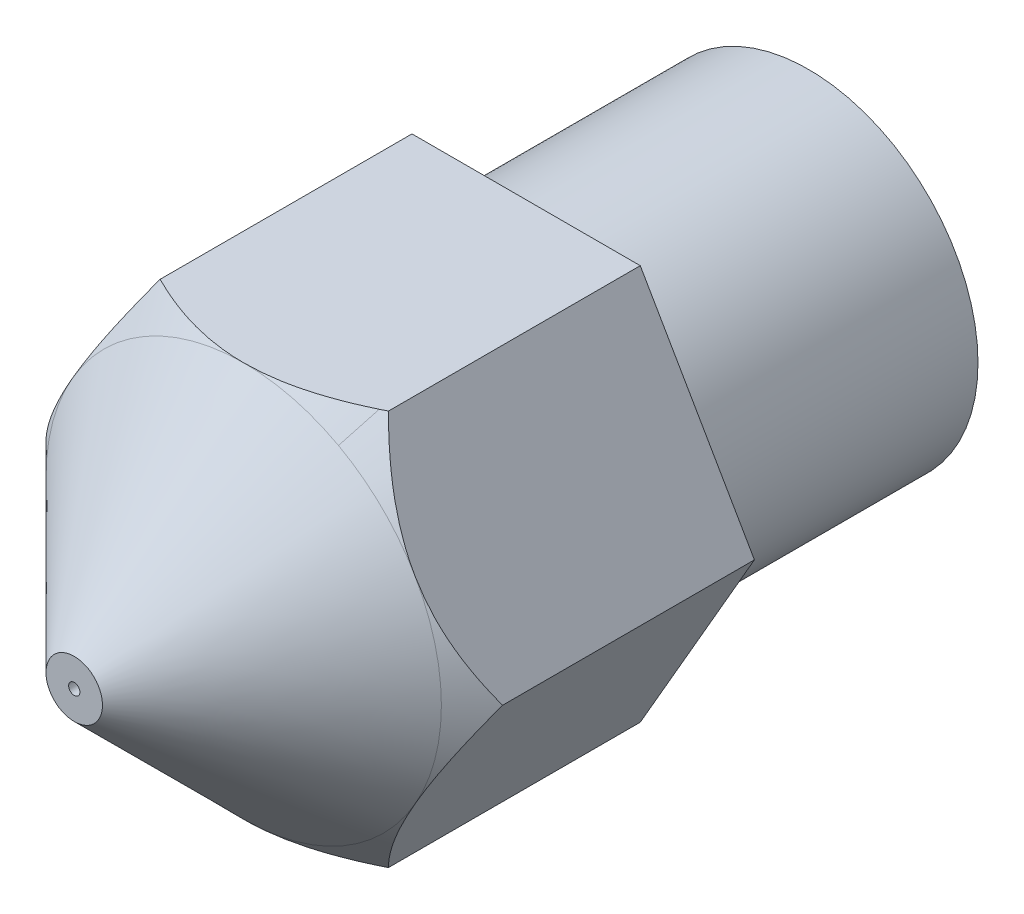
ISO-10303-21;
HEADER;
FILE_DESCRIPTION(('STEP AP214'),'2;1');
FILE_NAME('part.step','',(''),(''),'','','');
FILE_SCHEMA(('AUTOMOTIVE_DESIGN { 1 0 10303 214 1 1 1 1 }'));
ENDSEC;
DATA;
#1=APPLICATION_CONTEXT('core data for automotive mechanical design processes');
#2=APPLICATION_PROTOCOL_DEFINITION('international standard','automotive_design',2000,#1);
#3=PRODUCT_CONTEXT('',#1,'mechanical');
#4=PRODUCT('Part','Part','',(#3));
#5=PRODUCT_RELATED_PRODUCT_CATEGORY('part','',(#4));
#6=PRODUCT_DEFINITION_FORMATION('','',#4);
#7=PRODUCT_DEFINITION_CONTEXT('part definition',#1,'design');
#8=PRODUCT_DEFINITION('design','',#6,#7);
#9=PRODUCT_DEFINITION_SHAPE('','',#8);
#10=(LENGTH_UNIT() NAMED_UNIT(*) SI_UNIT(.MILLI.,.METRE.));
#11=(NAMED_UNIT(*) PLANE_ANGLE_UNIT() SI_UNIT($,.RADIAN.));
#12=(NAMED_UNIT(*) SI_UNIT($,.STERADIAN.) SOLID_ANGLE_UNIT());
#13=UNCERTAINTY_MEASURE_WITH_UNIT(LENGTH_MEASURE(1.E-05),#10,'distance_accuracy_value','');
#14=(GEOMETRIC_REPRESENTATION_CONTEXT(3) GLOBAL_UNCERTAINTY_ASSIGNED_CONTEXT((#13)) GLOBAL_UNIT_ASSIGNED_CONTEXT((#10,
#11,#12)) REPRESENTATION_CONTEXT('',''));
#15=CARTESIAN_POINT('',(0.,0.,0.));
#16=DIRECTION('',(0.,0.,1.));
#17=DIRECTION('',(1.,0.,0.));
#18=AXIS2_PLACEMENT_3D('',#15,#16,#17);
#19=CARTESIAN_POINT('',(0.,0.,8.));
#20=DIRECTION('',(0.,0.,1.));
#21=DIRECTION('',(1.,0.,0.));
#22=AXIS2_PLACEMENT_3D('',#19,#20,#21);
#23=PLANE('',#22);
#24=CARTESIAN_POINT('',(0.,0.,8.));
#25=DIRECTION('',(0.,0.,1.));
#26=DIRECTION('',(1.,0.,0.));
#27=AXIS2_PLACEMENT_3D('',#24,#25,#26);
#28=CIRCLE('',#27,0.1);
#29=CARTESIAN_POINT('',(0.1,0.,8.));
#30=VERTEX_POINT('',#29);
#31=EDGE_CURVE('E163',#30,#30,#28,.F.);
#32=ORIENTED_EDGE('',*,*,#31,.T.);
#33=EDGE_LOOP('',(#32));
#34=FACE_BOUND('',#33,.T.);
#35=CARTESIAN_POINT('',(0.,0.,7.99999999998136));
#36=DIRECTION('',(0.,0.,-1.));
#37=DIRECTION('',(-1.,0.,0.));
#38=AXIS2_PLACEMENT_3D('',#35,#36,#37);
#39=CIRCLE('',#38,0.499999999966849);
#40=CARTESIAN_POINT('',(-0.499999999966849,0.,7.99999999998136));
#41=VERTEX_POINT('',#40);
#42=EDGE_CURVE('E19',#41,#41,#39,.T.);
#43=ORIENTED_EDGE('',*,*,#42,.F.);
#44=EDGE_LOOP('',(#43));
#45=FACE_BOUND('',#44,.T.);
#46=ADVANCED_FACE('F16',(#34,#45),#23,.T.);
#47=CARTESIAN_POINT('',(0.,0.,4.99999999999545));
#48=DIRECTION('',(0.,0.,-1.));
#49=DIRECTION('',(-1.,0.,0.));
#50=AXIS2_PLACEMENT_3D('',#47,#48,#49);
#51=CONICAL_SURFACE('',#50,3.49999999999449,0.785398163404405);
#52=ORIENTED_EDGE('',*,*,#42,.T.);
#53=EDGE_LOOP('',(#52));
#54=FACE_BOUND('',#53,.T.);
#55=CARTESIAN_POINT('',(0.,0.,4.99999999999545));
#56=DIRECTION('',(0.,0.,-1.));
#57=DIRECTION('',(-0.479425538613188,-0.877582561885464,0.));
#58=AXIS2_PLACEMENT_3D('',#55,#56,#57);
#59=CIRCLE('',#58,3.49999999999449);
#60=CARTESIAN_POINT('',(1.67798938511631,3.07153896660527,4.99999999999545));
#61=VERTEX_POINT('',#60);
#62=CARTESIAN_POINT('',(3.03108891324506,1.74999999999715,4.99999999999179));
#63=VERTEX_POINT('',#62);
#64=EDGE_CURVE('E158',#61,#63,#59,.T.);
#65=ORIENTED_EDGE('',*,*,#64,.F.);
#66=CARTESIAN_POINT('',(0.,0.,4.99999999999545));
#67=DIRECTION('',(0.,0.,-1.));
#68=DIRECTION('',(-0.479425538613188,-0.877582561885464,0.));
#69=AXIS2_PLACEMENT_3D('',#66,#67,#68);
#70=CIRCLE('',#69,3.49999999999449);
#71=CARTESIAN_POINT('',(0.,3.49999999999725,4.9999999999927));
#72=VERTEX_POINT('',#71);
#73=EDGE_CURVE('E154',#72,#61,#70,.T.);
#74=ORIENTED_EDGE('',*,*,#73,.F.);
#75=CARTESIAN_POINT('',(0.,0.,4.99999999999545));
#76=DIRECTION('',(0.,0.,-1.));
#77=DIRECTION('',(-0.479425538613188,-0.877582561885464,0.));
#78=AXIS2_PLACEMENT_3D('',#75,#76,#77);
#79=CIRCLE('',#78,3.49999999999449);
#80=CARTESIAN_POINT('',(-3.03108891324352,1.74999999999799,4.99999999999408));
#81=VERTEX_POINT('',#80);
#82=EDGE_CURVE('E145',#81,#72,#79,.T.);
#83=ORIENTED_EDGE('',*,*,#82,.F.);
#84=CARTESIAN_POINT('',(0.,0.,4.99999999999545));
#85=DIRECTION('',(0.,0.,-1.));
#86=DIRECTION('',(-0.479425538613188,-0.877582561885464,0.));
#87=AXIS2_PLACEMENT_3D('',#84,#85,#86);
#88=CIRCLE('',#87,3.49999999999449);
#89=CARTESIAN_POINT('',(-3.03108891324506,-1.74999999999715,4.99999999999179));
#90=VERTEX_POINT('',#89);
#91=EDGE_CURVE('E109',#90,#81,#88,.T.);
#92=ORIENTED_EDGE('',*,*,#91,.F.);
#93=CARTESIAN_POINT('',(0.,0.,4.99999999999545));
#94=DIRECTION('',(0.,0.,-1.));
#95=DIRECTION('',(-0.479425538613188,-0.877582561885464,0.));
#96=AXIS2_PLACEMENT_3D('',#93,#94,#95);
#97=CIRCLE('',#96,3.49999999999449);
#98=CARTESIAN_POINT('',(-1.67798938514352,-3.07153896659429,4.99999999999545));
#99=VERTEX_POINT('',#98);
#100=EDGE_CURVE('E110',#99,#90,#97,.T.);
#101=ORIENTED_EDGE('',*,*,#100,.F.);
#102=CARTESIAN_POINT('',(0.,0.,4.99999999999545));
#103=DIRECTION('',(0.,0.,-1.));
#104=DIRECTION('',(-0.479425538613188,-0.877582561885464,0.));
#105=AXIS2_PLACEMENT_3D('',#102,#103,#104);
#106=CIRCLE('',#105,3.49999999999449);
#107=CARTESIAN_POINT('',(0.,-3.49999999999725,4.9999999999927));
#108=VERTEX_POINT('',#107);
#109=EDGE_CURVE('E143',#108,#99,#106,.T.);
#110=ORIENTED_EDGE('',*,*,#109,.F.);
#111=CARTESIAN_POINT('',(0.,0.,4.99999999999545));
#112=DIRECTION('',(0.,0.,-1.));
#113=DIRECTION('',(-0.479425538613188,-0.877582561885464,0.));
#114=AXIS2_PLACEMENT_3D('',#111,#112,#113);
#115=CIRCLE('',#114,3.49999999999449);
#116=CARTESIAN_POINT('',(3.03108891324233,-1.7499999999973,4.99999999999545));
#117=VERTEX_POINT('',#116);
#118=EDGE_CURVE('E159',#117,#108,#115,.T.);
#119=ORIENTED_EDGE('',*,*,#118,.F.);
#120=CARTESIAN_POINT('',(0.,0.,4.99999999999545));
#121=DIRECTION('',(0.,0.,-1.));
#122=DIRECTION('',(-0.479425538613188,-0.877582561885464,0.));
#123=AXIS2_PLACEMENT_3D('',#120,#121,#122);
#124=CIRCLE('',#123,3.49999999999449);
#125=EDGE_CURVE('E169',#63,#117,#124,.T.);
#126=ORIENTED_EDGE('',*,*,#125,.F.);
#127=EDGE_LOOP('',(#65,#74,#83,#92,#101,#110,#119,#126));
#128=FACE_BOUND('',#127,.T.);
#129=ADVANCED_FACE('F316',(#54,#128),#51,.T.);
#130=CARTESIAN_POINT('',(0.,0.,1.));
#131=DIRECTION('',(0.,0.,1.));
#132=DIRECTION('',(1.,0.,0.));
#133=AXIS2_PLACEMENT_3D('',#130,#131,#132);
#134=CYLINDRICAL_SURFACE('',#133,0.1);
#135=ORIENTED_EDGE('',*,*,#31,.F.);
#136=EDGE_LOOP('',(#135));
#137=FACE_BOUND('',#136,.T.);
#138=CARTESIAN_POINT('',(0.,0.,1.99999999995271));
#139=DIRECTION('',(0.,0.,-1.));
#140=DIRECTION('',(-0.499999999936058,0.866025403821355,0.));
#141=AXIS2_PLACEMENT_3D('',#138,#139,#140);
#142=CIRCLE('',#141,0.10000000004453);
#143=CARTESIAN_POINT('',(0.,0.100000000031742,1.99999999995271));
#144=VERTEX_POINT('',#143);
#145=EDGE_CURVE('E166',#144,#144,#142,.T.);
#146=ORIENTED_EDGE('',*,*,#145,.T.);
#147=EDGE_LOOP('',(#146));
#148=FACE_BOUND('',#147,.T.);
#149=ADVANCED_FACE('F313',(#137,#148),#134,.F.);
#150=CARTESIAN_POINT('',(0.,0.,4.50884188188638));
#151=DIRECTION('',(0.,0.,-1.));
#152=DIRECTION('',(-1.,0.,0.));
#153=AXIS2_PLACEMENT_3D('',#150,#151,#152);
#154=CONICAL_SURFACE('',#153,3.99115811808314,0.785398163376653);
#155=DIRECTION('',(-0.339005049414701,-0.62054458056685,0.707106781186864));
#156=VECTOR('',#155,1.);
#157=CARTESIAN_POINT('',(239237.418875991,437921.157837067,-499000.));
#158=LINE('',#157,#156);
#159=CARTESIAN_POINT('',(1.91205871444601,3.50000000001546,4.51177125432949));
#160=VERTEX_POINT('',#159);
#161=EDGE_CURVE('E155',#160,#61,#158,.T.);
#162=ORIENTED_EDGE('',*,*,#161,.F.);
#163=CARTESIAN_POINT('',(0.,3.5,4.99999999998995));
#164=CARTESIAN_POINT('',(0.0537438893032108,3.5,5.00000431749704));
#165=CARTESIAN_POINT('',(0.107479833407779,3.5,4.99876149669539));
#166=CARTESIAN_POINT('',(0.214830405224614,3.5,4.9938221542953));
#167=CARTESIAN_POINT('',(0.26844505113223,3.5,4.9901260291036));
#168=CARTESIAN_POINT('',(0.428769144050172,3.5,4.97543679142863));
#169=CARTESIAN_POINT('',(0.535166225902362,3.5,4.96084250504679));
#170=CARTESIAN_POINT('',(0.744779456587498,3.5,4.92310106018742));
#171=CARTESIAN_POINT('',(0.848019372518869,3.5,4.90008257610918));
#172=CARTESIAN_POINT('',(1.05252816611021,3.5,4.84649885465057));
#173=CARTESIAN_POINT('',(1.15379650458905,3.5,4.81593158327798));
#174=CARTESIAN_POINT('',(1.36592879175843,3.5,4.74438489942457));
#175=CARTESIAN_POINT('',(1.47652073770405,3.5,4.7026037731094));
#176=CARTESIAN_POINT('',(1.64079899800747,3.5,4.63480851594186));
#177=CARTESIAN_POINT('',(1.69551871252038,3.5,4.61124519525393));
#178=CARTESIAN_POINT('',(1.804286325757,3.5,4.56260407103472));
#179=CARTESIAN_POINT('',(1.85833417615542,3.5,4.53752615931454));
#180=CARTESIAN_POINT('',(1.91205871444325,3.5,4.51177125433852));
#181=B_SPLINE_CURVE_WITH_KNOTS('',3,(#163,#164,#165,#166,#167,#168,#169,#170,#171,#172,#173,
#174,#175,#176,#177,#178,#179,#180),.UNSPECIFIED.,.F.,.F.,(4,2,2,2,2,2,2,2,4),(0.,
0.161202115345872,0.322378189873716,0.644110241389111,0.96112022882094,1.27821572677109,
1.63260008764051,1.81131453854064,1.99004177034235),.UNSPECIFIED.);
#182=EDGE_CURVE('E303',#72,#160,#181,.T.);
#183=ORIENTED_EDGE('',*,*,#182,.F.);
#184=ORIENTED_EDGE('',*,*,#73,.T.);
#185=EDGE_LOOP('',(#162,#183,#184));
#186=FACE_BOUND('',#185,.T.);
#187=ADVANCED_FACE('F309',(#186),#154,.T.);
#188=CARTESIAN_POINT('',(0.,0.,4.45529940435563));
#189=DIRECTION('',(0.,0.,-1.));
#190=DIRECTION('',(-1.,0.,0.));
#191=AXIS2_PLACEMENT_3D('',#188,#189,#190);
#192=CONICAL_SURFACE('',#191,4.04470059560024,0.785398163366167);
#193=CARTESIAN_POINT('',(-2.0207259421453,3.50000000000495,4.4585481156406));
#194=CARTESIAN_POINT('',(-1.88093245125424,3.50000000000178,4.52837901779885));
#195=CARTESIAN_POINT('',(-1.73877627194134,3.50000000000048,4.59408444813629));
#196=CARTESIAN_POINT('',(-1.44879621006772,3.49999999999952,4.71432170134832));
#197=CARTESIAN_POINT('',(-1.30094201394446,3.49999999999987,4.76877974900684));
#198=CARTESIAN_POINT('',(-1.00476955778069,3.50000000000012,4.86126198885048));
#199=CARTESIAN_POINT('',(-0.856589672550079,3.50000000000003,4.89971780194353));
#200=CARTESIAN_POINT('',(-0.557051165534245,3.49999999999997,4.95896722032684));
#201=CARTESIAN_POINT('',(-0.405703721611407,3.5,4.97981478228911));
#202=CARTESIAN_POINT('',(-0.211604713619826,3.5,4.99386421136813));
#203=CARTESIAN_POINT('',(-0.169418902116069,3.5,4.99615704013281));
#204=CARTESIAN_POINT('',(-0.0848248871934939,3.5,4.99922734323527));
#205=CARTESIAN_POINT('',(-0.0424164647566726,3.5,4.99999877926437));
#206=CARTESIAN_POINT('',(0.,3.5,4.99999999998995));
#207=B_SPLINE_CURVE_WITH_KNOTS('',3,(#193,#194,#195,#196,#197,#198,#199,#200,#201,#202,#203,
#204,#205,#206),.UNSPECIFIED.,.F.,.F.,(4,2,2,2,2,2,4),(0.,0.469138863495916,0.941263532800035,
1.39966676490611,1.85666017013994,1.9833846993536,2.11061118578312),.UNSPECIFIED.);
#208=CARTESIAN_POINT('',(-2.02072594215211,3.5,4.45854811563448));
#209=VERTEX_POINT('',#208);
#210=EDGE_CURVE('E168',#209,#72,#207,.T.);
#211=ORIENTED_EDGE('',*,*,#210,.F.);
#212=CARTESIAN_POINT('',(-3.03108891324427,1.74999999999669,4.9999999999927));
#213=CARTESIAN_POINT('',(-3.00421079533933,1.79655426581984,5.00000430478493));
#214=CARTESIAN_POINT('',(-2.97733669567372,1.84310157184832,4.99876092163781));
#215=CARTESIAN_POINT('',(-2.92364907978139,1.93609125031104,4.99381933157334));
#216=CARTESIAN_POINT('',(-2.89683555469021,1.98253363809896,4.99012151081294));
#217=CARTESIAN_POINT('',(-2.81665771079426,2.12140573736801,4.97542599030519));
#218=CARTESIAN_POINT('',(-2.7634495324566,2.21356500562696,4.96082591162071));
#219=CARTESIAN_POINT('',(-2.65864660024935,2.39508900899203,4.92307849944173));
#220=CARTESIAN_POINT('',(-2.60703961580362,2.48447492807741,4.90006339489302));
#221=CARTESIAN_POINT('',(-2.50480485278373,2.66155073192752,4.84648680808277));
#222=CARTESIAN_POINT('',(-2.45417738625082,2.74924007622099,4.8159229623821));
#223=CARTESIAN_POINT('',(-2.37137915307603,2.89265082285657,4.76007104483655));
#224=CARTESIAN_POINT('',(-2.33889170641545,2.94892073108087,4.73662459520982));
#225=CARTESIAN_POINT('',(-2.27439263502874,3.06063639976359,4.68728344893833));
#226=CARTESIAN_POINT('',(-2.24238091158375,3.11608233120814,4.66138926867729));
#227=CARTESIAN_POINT('',(-2.17849278972643,3.22673980426511,4.60714796470752));
#228=CARTESIAN_POINT('',(-2.14662121330806,3.281942993939,4.57877824562128));
#229=CARTESIAN_POINT('',(-2.08333556510007,3.39155695202512,4.52007399758517));
#230=CARTESIAN_POINT('',(-2.05192146301108,3.44596777291738,4.48973959949117));
#231=CARTESIAN_POINT('',(-2.02072594216774,3.49999999998659,4.45854811563828));
#232=B_SPLINE_CURVE_WITH_KNOTS('',3,(#212,#213,#214,#215,#216,#217,#218,#219,#220,#221,#222,
#223,#224,#225,#226,#227,#228,#229,#230,#231),.UNSPECIFIED.,.F.,.F.,(4,2,2,2,2,2,2,2,2,4),(0.,
0.161238963214723,0.32245256469639,0.644242625542242,0.961179512540262,1.27821575553687,
1.4853966724577,1.69253397873911,1.90181313166027,2.11107836001675),.UNSPECIFIED.);
#233=EDGE_CURVE('E274',#81,#209,#232,.T.);
#234=ORIENTED_EDGE('',*,*,#233,.F.);
#235=ORIENTED_EDGE('',*,*,#82,.T.);
#236=EDGE_LOOP('',(#211,#234,#235));
#237=FACE_BOUND('',#236,.T.);
#238=ADVANCED_FACE('F260',(#237),#192,.T.);
#239=CARTESIAN_POINT('',(0.,0.,4.45529940435563));
#240=DIRECTION('',(0.,0.,-1.));
#241=DIRECTION('',(-1.,0.,0.));
#242=AXIS2_PLACEMENT_3D('',#239,#240,#241);
#243=CONICAL_SURFACE('',#242,4.04470059560024,0.785398163366167);
#244=CARTESIAN_POINT('',(-2.02072594544719,-3.49999999431558,4.4585481189098));
#245=CARTESIAN_POINT('',(-2.09062269069288,-3.3789352802664,4.52837902070183));
#246=CARTESIAN_POINT('',(-2.16170078014426,-3.25582441803175,4.59408445067835));
#247=CARTESIAN_POINT('',(-2.30669081065126,-3.00469431860279,4.71432170320178));
#248=CARTESIAN_POINT('',(-2.38061790848794,-2.87664882909362,4.76877975053348));
#249=CARTESIAN_POINT('',(-2.52870413611872,-2.62015595893601,4.86126198980828));
#250=CARTESIAN_POINT('',(-2.60279407850878,-2.49182841438666,4.8997178026552));
#251=CARTESIAN_POINT('',(-2.75256333155182,-2.2324204587046,4.95896722064473));
#252=CARTESIAN_POINT('',(-2.82823705327371,-2.10134972788451,4.97981478245866));
#253=CARTESIAN_POINT('',(-2.92528655692934,-1.93325505670372,4.99386421142341));
#254=CARTESIAN_POINT('',(-2.94637946258379,-1.89672107243096,4.99615704016684));
#255=CARTESIAN_POINT('',(-2.98867646984895,-1.82346050683963,4.99922734324072));
#256=CARTESIAN_POINT('',(-3.00988068096865,-1.78673373584592,4.99999877926258));
#257=CARTESIAN_POINT('',(-3.03108891324823,-1.74999999999898,4.99999999998812));
#258=B_SPLINE_CURVE_WITH_KNOTS('',3,(#244,#245,#246,#247,#248,#249,#250,#251,#252,#253,#254,
#255,#256,#257),.UNSPECIFIED.,.F.,.F.,(4,2,2,2,2,2,4),(0.,0.469138861928364,0.941263529629626,
1.39966676024786,1.85666016400893,1.98338469263572,2.11061117847293),.UNSPECIFIED.);
#259=CARTESIAN_POINT('',(-2.02072595931352,-3.49999999715779,4.4585481095152));
#260=VERTEX_POINT('',#259);
#261=EDGE_CURVE('E114',#260,#90,#258,.T.);
#262=ORIENTED_EDGE('',*,*,#261,.F.);
#263=CARTESIAN_POINT('',(-2.02072597317138,-3.49999999996139,4.45854810010368));
#264=CARTESIAN_POINT('',(-2.00268836185175,-3.49999999998069,4.46756888870002));
#265=CARTESIAN_POINT('',(-1.98461395233641,-3.49999999999357,4.47651454535225));
#266=CARTESIAN_POINT('',(-1.94839153278238,-3.50000000000643,4.49425559679223));
#267=CARTESIAN_POINT('',(-1.93024352272689,-3.50000000000643,4.5030509915457));
#268=CARTESIAN_POINT('',(-1.91205871445891,-3.5,4.51177125432077));
#269=B_SPLINE_CURVE_WITH_KNOTS('',3,(#263,#264,#265,#266,#267,#268),.UNSPECIFIED.,.F.,.F.,(4,2,
4),(0.,0.0605010865225517,0.121002186848004),.UNSPECIFIED.);
#270=CARTESIAN_POINT('',(-1.91205871447004,-3.49999999998704,4.51177125432478));
#271=VERTEX_POINT('',#270);
#272=EDGE_CURVE('E97',#260,#271,#269,.T.);
#273=ORIENTED_EDGE('',*,*,#272,.T.);
#274=DIRECTION('',(0.339005049420893,0.620544580563467,0.707106781186864));
#275=VECTOR('',#274,1.);
#276=CARTESIAN_POINT('',(-239237.418880361,-437921.157834679,-499000.));
#277=LINE('',#276,#275);
#278=EDGE_CURVE('E377',#99,#271,#277,.F.);
#279=ORIENTED_EDGE('',*,*,#278,.F.);
#280=ORIENTED_EDGE('',*,*,#100,.T.);
#281=EDGE_LOOP('',(#262,#273,#279,#280));
#282=FACE_BOUND('',#281,.T.);
#283=ADVANCED_FACE('F115',(#282),#243,.T.);
#284=CARTESIAN_POINT('',(0.,0.,4.45529940435563));
#285=DIRECTION('',(0.,0.,-1.));
#286=DIRECTION('',(-1.,0.,0.));
#287=AXIS2_PLACEMENT_3D('',#284,#285,#286);
#288=CONICAL_SURFACE('',#287,4.04470059560024,0.785398163366167);
#289=CARTESIAN_POINT('',(-4.04145188432461,1.39690937472253E-11,4.45854811564121));
#290=CARTESIAN_POINT('',(-3.97155513887492,0.121064714407657,4.52837901779927));
#291=CARTESIAN_POINT('',(-3.90047704921663,0.244175576997057,4.59408444813683));
#292=CARTESIAN_POINT('',(-3.75548701827816,0.495305677170666,4.71432170134937));
#293=CARTESIAN_POINT('',(-3.68155992021672,0.623351167070123,4.76877974900827));
#294=CARTESIAN_POINT('',(-3.53347369213465,0.879844038010078,4.86126198885251));
#295=CARTESIAN_POINT('',(-3.45938374951897,1.00817158294998,4.89971780194577));
#296=CARTESIAN_POINT('',(-3.30961449601044,1.2675795394381,4.95896722032942));
#297=CARTESIAN_POINT('',(-3.23394077404879,1.39865027067354,4.97981478229181));
#298=CARTESIAN_POINT('',(-3.13689127005297,1.56674494244358,4.99386421137084));
#299=CARTESIAN_POINT('',(-3.11579836430133,1.60327892688466,4.99615704013551));
#300=CARTESIAN_POINT('',(-3.07350135684053,1.67653949281485,4.99922734323797));
#301=CARTESIAN_POINT('',(-3.05229714562236,1.71326626397912,4.99999877926709));
#302=CARTESIAN_POINT('',(-3.03108891324427,1.74999999999669,4.9999999999927));
#303=B_SPLINE_CURVE_WITH_KNOTS('',3,(#289,#290,#291,#292,#293,#294,#295,#296,#297,#298,#299,
#300,#301,#302),.UNSPECIFIED.,.F.,.F.,(4,2,2,2,2,2,4),(0.,0.469138863497394,0.941263532803068,
1.39966676491064,1.85666017014595,1.98338469935812,2.11061118578613),.UNSPECIFIED.);
#304=CARTESIAN_POINT('',(-4.04145188432394,5.91748705095474E-12,4.45854811563213));
#305=VERTEX_POINT('',#304);
#306=EDGE_CURVE('E281',#305,#81,#303,.T.);
#307=ORIENTED_EDGE('',*,*,#306,.F.);
#308=CARTESIAN_POINT('',(-3.03108891324823,-1.74999999999898,4.99999999998812));
#309=CARTESIAN_POINT('',(-3.05796703115323,-1.70344573417571,5.00000430478026));
#310=CARTESIAN_POINT('',(-3.08484113081891,-1.65689842814711,4.99876092163304));
#311=CARTESIAN_POINT('',(-3.13852874671138,-1.56390874968416,4.99381933156837));
#312=CARTESIAN_POINT('',(-3.16534227180262,-1.51746636189613,4.99012151080787));
#313=CARTESIAN_POINT('',(-3.24552011569877,-1.37859426262674,4.97542599029979));
#314=CARTESIAN_POINT('',(-3.29872829403655,-1.28643499436757,4.96082591161508));
#315=CARTESIAN_POINT('',(-3.40353122624404,-1.10491099100209,4.92307849943563));
#316=CARTESIAN_POINT('',(-3.45513821068989,-1.01552507191651,4.90006339488668));
#317=CARTESIAN_POINT('',(-3.55737297371,-0.838449268066001,4.84648680807595));
#318=CARTESIAN_POINT('',(-3.60800044024303,-0.750759923772347,4.81592296237503));
#319=CARTESIAN_POINT('',(-3.69079867341746,-0.60734917713738,4.76007104482944));
#320=CARTESIAN_POINT('',(-3.72328612007759,-0.551079268913879,4.73662459520295));
#321=CARTESIAN_POINT('',(-3.78778519146338,-0.439363600232722,4.68728344893202));
#322=CARTESIAN_POINT('',(-3.81979691490794,-0.38391766878894,4.6613892686713));
#323=CARTESIAN_POINT('',(-3.88368503676437,-0.273260195733504,4.60714796470225));
#324=CARTESIAN_POINT('',(-3.91555661318229,-0.218057006060384,4.57877824561641));
#325=CARTESIAN_POINT('',(-3.97884226138941,-0.10844304797578,4.52007399758115));
#326=CARTESIAN_POINT('',(-4.01025636347797,-0.0540322270842658,4.4897395994876));
#327=CARTESIAN_POINT('',(-4.04145188432089,-1.57824670111829E-11,4.45854811563519));
#328=B_SPLINE_CURVE_WITH_KNOTS('',3,(#308,#309,#310,#311,#312,#313,#314,#315,#316,#317,#318,
#319,#320,#321,#322,#323,#324,#325,#326,#327),.UNSPECIFIED.,.F.,.F.,(4,2,2,2,2,2,2,2,2,4),(0.,
0.161238963215139,0.322452564697221,0.6442426255439,0.961179512542764,1.27821575554022,
1.48539667245821,1.69253397873679,1.90181313165504,2.11107836000861),.UNSPECIFIED.);
#329=EDGE_CURVE('E119',#90,#305,#328,.T.);
#330=ORIENTED_EDGE('',*,*,#329,.F.);
#331=ORIENTED_EDGE('',*,*,#91,.T.);
#332=EDGE_LOOP('',(#307,#330,#331));
#333=FACE_BOUND('',#332,.T.);
#334=ADVANCED_FACE('F259',(#333),#288,.T.);
#335=CARTESIAN_POINT('',(0.,0.,4.50884188188638));
#336=DIRECTION('',(0.,0.,-1.));
#337=DIRECTION('',(-1.,0.,0.));
#338=AXIS2_PLACEMENT_3D('',#335,#336,#337);
#339=CONICAL_SURFACE('',#338,3.99115811808314,0.785398163376653);
#340=ORIENTED_EDGE('',*,*,#278,.T.);
#341=CARTESIAN_POINT('',(0.,-3.5,4.99999999998994));
#342=CARTESIAN_POINT('',(-0.0537438893032127,-3.5,5.00000431749703));
#343=CARTESIAN_POINT('',(-0.107479833407783,-3.5,4.99876149669538));
#344=CARTESIAN_POINT('',(-0.214830405224623,-3.5,4.99382215429529));
#345=CARTESIAN_POINT('',(-0.268445051132242,-3.5,4.99012602910359));
#346=CARTESIAN_POINT('',(-0.42876914405019,-3.5,4.97543679142862));
#347=CARTESIAN_POINT('',(-0.535166225902384,-3.5,4.96084250504678));
#348=CARTESIAN_POINT('',(-0.744779456587519,-3.5,4.92310106018741));
#349=CARTESIAN_POINT('',(-0.848019372518886,-3.5,4.90008257610917));
#350=CARTESIAN_POINT('',(-1.05252816611022,-3.5,4.84649885465056));
#351=CARTESIAN_POINT('',(-1.15379650458906,-3.5,4.81593158327798));
#352=CARTESIAN_POINT('',(-1.36592879176183,-3.5,4.74438489942341));
#353=CARTESIAN_POINT('',(-1.47652073771078,-3.5,4.70260377310686));
#354=CARTESIAN_POINT('',(-1.64079899801909,-3.5,4.63480851593694));
#355=CARTESIAN_POINT('',(-1.69551871253363,-3.5,4.61124519524816));
#356=CARTESIAN_POINT('',(-1.80428632577347,-3.5,4.56260407102718));
#357=CARTESIAN_POINT('',(-1.85833417617348,-3.5,4.53752615930608));
#358=CARTESIAN_POINT('',(-1.91205871446288,-3.5,4.51177125432911));
#359=B_SPLINE_CURVE_WITH_KNOTS('',3,(#341,#342,#343,#344,#345,#346,#347,#348,#349,#350,#351,
#352,#353,#354,#355,#356,#357,#358),.UNSPECIFIED.,.F.,.F.,(4,2,2,2,2,2,2,2,4),(0.,
0.161202115345879,0.32237818987373,0.644110241389137,0.961120228820953,1.27821572677109,
1.63260008765129,1.81131453855691,1.99004177036412),.UNSPECIFIED.);
#360=EDGE_CURVE('E105',#108,#271,#359,.T.);
#361=ORIENTED_EDGE('',*,*,#360,.F.);
#362=ORIENTED_EDGE('',*,*,#109,.T.);
#363=EDGE_LOOP('',(#340,#361,#362));
#364=FACE_BOUND('',#363,.T.);
#365=ADVANCED_FACE('F385',(#364),#339,.T.);
#366=CARTESIAN_POINT('',(0.,0.,4.45529940435563));
#367=DIRECTION('',(0.,0.,-1.));
#368=DIRECTION('',(-1.,0.,0.));
#369=AXIS2_PLACEMENT_3D('',#366,#367,#368);
#370=CONICAL_SURFACE('',#369,4.04470059560024,0.785398163366167);
#371=CARTESIAN_POINT('',(2.0207259421453,-3.50000000000495,4.4585481156406));
#372=CARTESIAN_POINT('',(1.88093245125423,-3.50000000000178,4.52837901779885));
#373=CARTESIAN_POINT('',(1.73877627194134,-3.50000000000048,4.59408444813629));
#374=CARTESIAN_POINT('',(1.44879621006772,-3.49999999999952,4.71432170134832));
#375=CARTESIAN_POINT('',(1.30094201394446,-3.49999999999987,4.76877974900683));
#376=CARTESIAN_POINT('',(1.00476955778069,-3.50000000000012,4.86126198885048));
#377=CARTESIAN_POINT('',(0.856589672550077,-3.50000000000003,4.89971780194353));
#378=CARTESIAN_POINT('',(0.557051165534243,-3.49999999999997,4.95896722032684));
#379=CARTESIAN_POINT('',(0.405703721611405,-3.5,4.9798147822891));
#380=CARTESIAN_POINT('',(0.211604713619825,-3.5,4.99386421136813));
#381=CARTESIAN_POINT('',(0.169418902116068,-3.5,4.99615704013281));
#382=CARTESIAN_POINT('',(0.0848248871934935,-3.5,4.99922734323527));
#383=CARTESIAN_POINT('',(0.0424164647566726,-3.5,4.99999877926437));
#384=CARTESIAN_POINT('',(0.,-3.5,4.99999999998994));
#385=B_SPLINE_CURVE_WITH_KNOTS('',3,(#371,#372,#373,#374,#375,#376,#377,#378,#379,#380,#381,
#382,#383,#384),.UNSPECIFIED.,.F.,.F.,(4,2,2,2,2,2,4),(0.,0.469138863495916,0.941263532800035,
1.39966676490611,1.85666017013994,1.9833846993536,2.11061118578312),.UNSPECIFIED.);
#386=CARTESIAN_POINT('',(2.02072594215211,-3.5,4.45854811563448));
#387=VERTEX_POINT('',#386);
#388=EDGE_CURVE('E126',#387,#108,#385,.T.);
#389=ORIENTED_EDGE('',*,*,#388,.F.);
#390=CARTESIAN_POINT('',(3.03108891324427,-1.74999999999669,4.9999999999927));
#391=CARTESIAN_POINT('',(3.00421079533933,-1.79655426581984,5.00000430478493));
#392=CARTESIAN_POINT('',(2.97733669567373,-1.84310157184832,4.9987609216378));
#393=CARTESIAN_POINT('',(2.92364907978139,-1.93609125031104,4.99381933157333));
#394=CARTESIAN_POINT('',(2.89683555469021,-1.98253363809896,4.99012151081294));
#395=CARTESIAN_POINT('',(2.81665771079426,-2.12140573736801,4.97542599030519));
#396=CARTESIAN_POINT('',(2.76344953245661,-2.21356500562696,4.9608259116207));
#397=CARTESIAN_POINT('',(2.65864660024935,-2.39508900899203,4.92307849944173));
#398=CARTESIAN_POINT('',(2.60703961580362,-2.48447492807741,4.90006339489301));
#399=CARTESIAN_POINT('',(2.50480485278374,-2.66155073192752,4.84648680808277));
#400=CARTESIAN_POINT('',(2.45417738625082,-2.74924007622098,4.8159229623821));
#401=CARTESIAN_POINT('',(2.37137915307603,-2.89265082285657,4.76007104483655));
#402=CARTESIAN_POINT('',(2.33889170641545,-2.94892073108086,4.73662459520982));
#403=CARTESIAN_POINT('',(2.27439263502874,-3.06063639976359,4.68728344893833));
#404=CARTESIAN_POINT('',(2.24238091158375,-3.11608233120814,4.66138926867728));
#405=CARTESIAN_POINT('',(2.17849278972643,-3.22673980426511,4.60714796470752));
#406=CARTESIAN_POINT('',(2.14662121330807,-3.281942993939,4.57877824562128));
#407=CARTESIAN_POINT('',(2.08333556510007,-3.39155695202512,4.52007399758517));
#408=CARTESIAN_POINT('',(2.05192146301108,-3.44596777291737,4.48973959949117));
#409=CARTESIAN_POINT('',(2.02072594216774,-3.49999999998659,4.45854811563828));
#410=B_SPLINE_CURVE_WITH_KNOTS('',3,(#390,#391,#392,#393,#394,#395,#396,#397,#398,#399,#400,
#401,#402,#403,#404,#405,#406,#407,#408,#409),.UNSPECIFIED.,.F.,.F.,(4,2,2,2,2,2,2,2,2,4),(0.,
0.161238963214723,0.322452564696391,0.644242625542242,0.961179512540262,1.27821575553687,
1.4853966724577,1.69253397873911,1.90181313166027,2.11107836001675),.UNSPECIFIED.);
#411=EDGE_CURVE('E217',#117,#387,#410,.T.);
#412=ORIENTED_EDGE('',*,*,#411,.F.);
#413=ORIENTED_EDGE('',*,*,#118,.T.);
#414=EDGE_LOOP('',(#389,#412,#413));
#415=FACE_BOUND('',#414,.T.);
#416=ADVANCED_FACE('F389',(#415),#370,.T.);
#417=CARTESIAN_POINT('',(0.,0.,4.45529940435563));
#418=DIRECTION('',(0.,0.,-1.));
#419=DIRECTION('',(-1.,0.,0.));
#420=AXIS2_PLACEMENT_3D('',#417,#418,#419);
#421=CONICAL_SURFACE('',#420,4.04470059560024,0.785398163366167);
#422=CARTESIAN_POINT('',(2.020725942176,3.4999999999903,4.4585481156372));
#423=CARTESIAN_POINT('',(2.09062268761916,3.37893528559342,4.52837901779574));
#424=CARTESIAN_POINT('',(2.16170077727471,3.25582442300281,4.59408444813339));
#425=CARTESIAN_POINT('',(2.30669080821102,3.00469432282856,4.71432170134574));
#426=CARTESIAN_POINT('',(2.38061790627306,2.87664883292967,4.76877974900437));
#427=CARTESIAN_POINT('',(2.5287041343554,2.62015596199041,4.86126198884823));
#428=CARTESIAN_POINT('',(2.60279407697076,2.49182841705065,4.89971780194138));
#429=CARTESIAN_POINT('',(2.75256333047888,2.23242046056294,4.95896722032485));
#430=CARTESIAN_POINT('',(2.82823705244045,2.10134972932777,4.97981478228718));
#431=CARTESIAN_POINT('',(2.9252865564367,1.933255057557,4.9938642113663));
#432=CARTESIAN_POINT('',(2.9463794621889,1.89672107311495,4.99615704013102));
#433=CARTESIAN_POINT('',(2.98867646965083,1.82346050718279,4.99922734323349));
#434=CARTESIAN_POINT('',(3.00988068086957,1.78673373601753,4.99999877926258));
#435=CARTESIAN_POINT('',(3.03108891324823,1.74999999999898,4.99999999998812));
#436=B_SPLINE_CURVE_WITH_KNOTS('',3,(#422,#423,#424,#425,#426,#427,#428,#429,#430,#431,#432,
#433,#434,#435),.UNSPECIFIED.,.F.,.F.,(4,2,2,2,2,2,4),(0.,0.469138863496621,0.941263532801447,
1.39966676490815,1.85666017014261,1.98338469935816,2.11061118578959),.UNSPECIFIED.);
#437=CARTESIAN_POINT('',(2.02072594215939,3.49999999999362,4.45854811563637));
#438=VERTEX_POINT('',#437);
#439=EDGE_CURVE('E187',#438,#63,#436,.T.);
#440=ORIENTED_EDGE('',*,*,#439,.F.);
#441=CARTESIAN_POINT('',(1.91205871443926,3.5,4.5117712543302));
#442=CARTESIAN_POINT('',(1.930243517495,3.5,4.50305099405228));
#443=CARTESIAN_POINT('',(1.94839152236057,3.5,4.49425560184109));
#444=CARTESIAN_POINT('',(1.98461393157941,3.5,4.47651455557589));
#445=CARTESIAN_POINT('',(2.00268833594948,3.5,4.46756890155618));
#446=CARTESIAN_POINT('',(2.02072594214616,3.5,4.45854811563746));
#447=B_SPLINE_CURVE_WITH_KNOTS('',3,(#441,#442,#443,#444,#445,#446),.UNSPECIFIED.,.F.,.F.,(4,2,
4),(0.,0.0605010829882069,0.12100215217345),.UNSPECIFIED.);
#448=EDGE_CURVE('E298',#160,#438,#447,.T.);
#449=ORIENTED_EDGE('',*,*,#448,.F.);
#450=ORIENTED_EDGE('',*,*,#161,.T.);
#451=ORIENTED_EDGE('',*,*,#64,.T.);
#452=EDGE_LOOP('',(#440,#449,#450,#451));
#453=FACE_BOUND('',#452,.T.);
#454=ADVANCED_FACE('F203',(#453),#421,.T.);
#455=CARTESIAN_POINT('',(0.,0.,4.45529940435563));
#456=DIRECTION('',(0.,0.,-1.));
#457=DIRECTION('',(-1.,0.,0.));
#458=AXIS2_PLACEMENT_3D('',#455,#456,#457);
#459=CONICAL_SURFACE('',#458,4.04470059560024,0.785398163366167);
#460=CARTESIAN_POINT('',(4.04145188432466,-1.36526386167552E-11,4.458548115641));
#461=CARTESIAN_POINT('',(3.97155513887503,-0.121064714407377,4.5283790177991));
#462=CARTESIAN_POINT('',(3.90047704921676,-0.244175576996801,4.5940844481367));
#463=CARTESIAN_POINT('',(3.7554870182783,-0.495305677170446,4.71432170134928));
#464=CARTESIAN_POINT('',(3.68155992021685,-0.623351167069915,4.76877974900819));
#465=CARTESIAN_POINT('',(3.53347369213475,-0.879844038009898,4.86126198885245));
#466=CARTESIAN_POINT('',(3.45938374951906,-1.00817158294981,4.89971780194573));
#467=CARTESIAN_POINT('',(3.30961449601052,-1.26757953943796,4.95896722032939));
#468=CARTESIAN_POINT('',(3.23394077404886,-1.39865027067342,4.97981478229179));
#469=CARTESIAN_POINT('',(3.13689127005302,-1.56674494244349,4.99386421137084));
#470=CARTESIAN_POINT('',(3.11579836430137,-1.60327892688459,4.9961570401355));
#471=CARTESIAN_POINT('',(3.07350135684055,-1.67653949281482,4.99922734323796));
#472=CARTESIAN_POINT('',(3.05229714562237,-1.7132662639791,4.99999877926708));
#473=CARTESIAN_POINT('',(3.03108891324427,-1.74999999999669,4.9999999999927));
#474=B_SPLINE_CURVE_WITH_KNOTS('',3,(#460,#461,#462,#463,#464,#465,#466,#467,#468,#469,#470,
#471,#472,#473),.UNSPECIFIED.,.F.,.F.,(4,2,2,2,2,2,4),(0.,0.469138863497457,0.941263532803195,
1.39966676491082,1.85666017014619,1.98338469935841,2.11061118578649),.UNSPECIFIED.);
#475=CARTESIAN_POINT('',(4.04145188432402,-5.77186533277225E-12,4.45854811563205));
#476=VERTEX_POINT('',#475);
#477=EDGE_CURVE('E210',#476,#117,#474,.T.);
#478=ORIENTED_EDGE('',*,*,#477,.F.);
#479=CARTESIAN_POINT('',(3.03108891324823,1.74999999999898,4.99999999998812));
#480=CARTESIAN_POINT('',(3.05796703115324,1.70344573417571,5.00000430478026));
#481=CARTESIAN_POINT('',(3.08484113081892,1.65689842814711,4.99876092163304));
#482=CARTESIAN_POINT('',(3.13852874671139,1.56390874968416,4.99381933156836));
#483=CARTESIAN_POINT('',(3.16534227180263,1.51746636189613,4.99012151080786));
#484=CARTESIAN_POINT('',(3.24552011569878,1.37859426262674,4.97542599029979));
#485=CARTESIAN_POINT('',(3.29872829403655,1.28643499436758,4.96082591161507));
#486=CARTESIAN_POINT('',(3.40353122624405,1.10491099100209,4.92307849943563));
#487=CARTESIAN_POINT('',(3.4551382106899,1.01552507191651,4.90006339488667));
#488=CARTESIAN_POINT('',(3.55737297371001,0.838449268066003,4.84648680807594));
#489=CARTESIAN_POINT('',(3.60800044024304,0.750759923772348,4.81592296237503));
#490=CARTESIAN_POINT('',(3.69079867341745,0.607349177137406,4.76007104482944));
#491=CARTESIAN_POINT('',(3.72328612007756,0.551079268913929,4.73662459520297));
#492=CARTESIAN_POINT('',(3.78778519146333,0.439363600232819,4.68728344893206));
#493=CARTESIAN_POINT('',(3.81979691490787,0.38391766878906,4.66138926867135));
#494=CARTESIAN_POINT('',(3.88368503676428,0.273260195733669,4.60714796470233));
#495=CARTESIAN_POINT('',(3.91555661318219,0.218057006060572,4.57877824561651));
#496=CARTESIAN_POINT('',(3.97884226138928,0.108443047976013,4.52007399758128));
#497=CARTESIAN_POINT('',(4.01025636347783,0.0540322270845211,4.48973959948774));
#498=CARTESIAN_POINT('',(4.04145188432073,1.60597641436886E-11,4.45854811563534));
#499=B_SPLINE_CURVE_WITH_KNOTS('',3,(#479,#480,#481,#482,#483,#484,#485,#486,#487,#488,#489,
#490,#491,#492,#493,#494,#495,#496,#497,#498),.UNSPECIFIED.,.F.,.F.,(4,2,2,2,2,2,2,2,2,4),(0.,
0.161238963215139,0.322452564697222,0.644242625543901,0.961179512542766,1.27821575554022,
1.48539667245812,1.69253397873661,1.90181313165478,2.11107836000826),.UNSPECIFIED.);
#500=EDGE_CURVE('E177',#63,#476,#499,.T.);
#501=ORIENTED_EDGE('',*,*,#500,.F.);
#502=ORIENTED_EDGE('',*,*,#125,.T.);
#503=EDGE_LOOP('',(#478,#501,#502));
#504=FACE_BOUND('',#503,.T.);
#505=ADVANCED_FACE('F198',(#504),#459,.T.);
#506=CARTESIAN_POINT('',(0.,0.,-1.13686480715525E-10));
#507=DIRECTION('',(0.,0.,-1.));
#508=DIRECTION('',(0.,1.,0.));
#509=AXIS2_PLACEMENT_3D('',#506,#507,#508);
#510=CONICAL_SURFACE('',#509,2.10000000009813,0.785398163397449);
#511=CARTESIAN_POINT('',(0.,0.,0.));
#512=DIRECTION('',(0.,0.,-1.));
#513=DIRECTION('',(-1.,0.,0.));
#514=AXIS2_PLACEMENT_3D('',#511,#512,#513);
#515=CIRCLE('',#514,2.1);
#516=CARTESIAN_POINT('',(0.,2.09999999998445,0.));
#517=VERTEX_POINT('',#516);
#518=EDGE_CURVE('E186',#517,#517,#515,.T.);
#519=CARTESIAN_POINT('',(0.,0.100000000031742,1.99999999995271));
#520=CARTESIAN_POINT('',(0.,0.120833333364583,1.97916666661987));
#521=CARTESIAN_POINT('',(0.,0.141666666697423,1.95833333328702));
#522=CARTESIAN_POINT('',(0.,0.183333333363105,1.91666666662134));
#523=CARTESIAN_POINT('',(0.,0.204166666695945,1.8958333332885));
#524=CARTESIAN_POINT('',(0.,0.245833333361627,1.85416666662282));
#525=CARTESIAN_POINT('',(0.,0.266666666694467,1.83333333328998));
#526=CARTESIAN_POINT('',(0.,0.308333333360149,1.7916666666243));
#527=CARTESIAN_POINT('',(0.,0.329166666692989,1.77083333329146));
#528=CARTESIAN_POINT('',(0.,0.370833333358671,1.72916666662578));
#529=CARTESIAN_POINT('',(0.,0.391666666691512,1.70833333329294));
#530=CARTESIAN_POINT('',(0.,0.433333333357193,1.66666666662725));
#531=CARTESIAN_POINT('',(0.,0.454166666690034,1.64583333329441));
#532=CARTESIAN_POINT('',(0.,0.495833333355715,1.60416666662873));
#533=CARTESIAN_POINT('',(0.,0.516666666688556,1.58333333329589));
#534=CARTESIAN_POINT('',(0.,0.558333333354237,1.54166666663021));
#535=CARTESIAN_POINT('',(0.,0.579166666687078,1.52083333329737));
#536=CARTESIAN_POINT('',(0.,0.620833333352759,1.47916666663169));
#537=CARTESIAN_POINT('',(0.,0.6416666666856,1.45833333329885));
#538=CARTESIAN_POINT('',(0.,0.683333333351281,1.41666666663317));
#539=CARTESIAN_POINT('',(0.,0.704166666684122,1.39583333330033));
#540=CARTESIAN_POINT('',(0.,0.745833333349804,1.35416666663464));
#541=CARTESIAN_POINT('',(0.,0.766666666682644,1.3333333333018));
#542=CARTESIAN_POINT('',(0.,0.808333333348326,1.29166666663612));
#543=CARTESIAN_POINT('',(0.,0.829166666681166,1.27083333330328));
#544=CARTESIAN_POINT('',(0.,0.870833333346848,1.2291666666376));
#545=CARTESIAN_POINT('',(0.,0.891666666679689,1.20833333330476));
#546=CARTESIAN_POINT('',(0.,0.93333333334537,1.16666666663908));
#547=CARTESIAN_POINT('',(0.,0.954166666678211,1.14583333330624));
#548=CARTESIAN_POINT('',(0.,0.995833333343892,1.10416666664056));
#549=CARTESIAN_POINT('',(0.,1.01666666667673,1.08333333330772));
#550=CARTESIAN_POINT('',(0.,1.05833333334241,1.04166666664203));
#551=CARTESIAN_POINT('',(0.,1.07916666667525,1.02083333330919));
#552=CARTESIAN_POINT('',(0.,1.12083333334094,0.979166666643512));
#553=CARTESIAN_POINT('',(0.,1.14166666667378,0.958333333310671));
#554=CARTESIAN_POINT('',(0.,1.18333333333946,0.91666666664499));
#555=CARTESIAN_POINT('',(0.,1.2041666666723,0.895833333312149));
#556=CARTESIAN_POINT('',(0.,1.24583333333798,0.854166666646468));
#557=CARTESIAN_POINT('',(0.,1.26666666667082,0.833333333313627));
#558=CARTESIAN_POINT('',(0.,1.3083333333365,0.791666666647946));
#559=CARTESIAN_POINT('',(0.,1.32916666666934,0.770833333315105));
#560=CARTESIAN_POINT('',(0.,1.37083333333502,0.729166666649424));
#561=CARTESIAN_POINT('',(0.,1.39166666666787,0.708333333316583));
#562=CARTESIAN_POINT('',(0.,1.43333333333355,0.666666666650902));
#563=CARTESIAN_POINT('',(0.,1.45416666666639,0.645833333318061));
#564=CARTESIAN_POINT('',(0.,1.49583333333207,0.60416666665238));
#565=CARTESIAN_POINT('',(0.,1.51666666666491,0.583333333319539));
#566=CARTESIAN_POINT('',(0.,1.55833333333059,0.541666666653858));
#567=CARTESIAN_POINT('',(0.,1.57916666666343,0.520833333321017));
#568=CARTESIAN_POINT('',(0.,1.62083333332911,0.479166666655336));
#569=CARTESIAN_POINT('',(0.,1.64166666666195,0.458333333322495));
#570=CARTESIAN_POINT('',(0.,1.68333333332764,0.416666666656814));
#571=CARTESIAN_POINT('',(0.,1.70416666666048,0.395833333323973));
#572=CARTESIAN_POINT('',(0.,1.74583333332616,0.354166666658292));
#573=CARTESIAN_POINT('',(0.,1.766666666659,0.333333333325451));
#574=CARTESIAN_POINT('',(0.,1.80833333332468,0.29166666665977));
#575=CARTESIAN_POINT('',(0.,1.82916666665752,0.270833333326929));
#576=CARTESIAN_POINT('',(0.,1.8708333333232,0.229166666661248));
#577=CARTESIAN_POINT('',(0.,1.89166666665604,0.208333333328407));
#578=CARTESIAN_POINT('',(0.,1.93333333332172,0.166666666662725));
#579=CARTESIAN_POINT('',(0.,1.95416666665456,0.145833333329885));
#580=CARTESIAN_POINT('',(0.,1.99583333332025,0.104166666664203));
#581=CARTESIAN_POINT('',(0.,2.01666666665309,0.0833333333313627));
#582=CARTESIAN_POINT('',(0.,2.05833333331877,0.0416666666656813));
#583=CARTESIAN_POINT('',(0.,2.07916666665161,0.0208333333328406));
#584=CARTESIAN_POINT('',(0.,2.09999999998445,0.));
#585=B_SPLINE_CURVE_WITH_KNOTS('',3,(#519,#520,#521,#522,#523,#524,#525,#526,#527,#528,#529,
#530,#531,#532,#533,#534,#535,#536,#537,#538,#539,#540,#541,#542,#543,#544,#545,#546,#547,#548,
#549,#550,#551,#552,#553,#554,#555,#556,#557,#558,#559,#560,#561,#562,#563,#564,#565,#566,#567,
#568,#569,#570,#571,#572,#573,#574,#575,#576,#577,#578,#579,#580,#581,#582,#583,#584),
.UNSPECIFIED.,.F.,.F.,(4,2,2,2,2,2,2,2,2,2,2,2,2,2,2,2,2,2,2,2,2,2,2,2,2,2,2,2,2,2,2,2,4),(0.,
0.0883883476462283,0.176776695292457,0.265165042938685,0.353553390584913,0.441941738231142,
0.53033008587737,0.618718433523599,0.707106781169827,0.795495128816055,0.883883476462283,
0.972271824108512,1.06066017175474,1.14904851940097,1.2374368670472,1.32582521469343,
1.41421356233965,1.50260190998588,1.59099025763211,1.67937860527834,1.76776695292457,
1.85615530057079,1.94454364821702,2.03293199586325,2.12132034350948,2.20970869115571,
2.29809703880194,2.38648538644816,2.47487373409439,2.56326208174062,2.65165042938685,
2.74003877703308,2.82842712467931),.UNSPECIFIED.);
#586=EDGE_CURVE('BSEAM202',#144,#517,#585,.T.);
#587=ORIENTED_EDGE('',*,*,#145,.F.);
#588=ORIENTED_EDGE('',*,*,#518,.T.);
#589=ORIENTED_EDGE('',*,*,#586,.T.);
#590=ORIENTED_EDGE('',*,*,#586,.F.);
#591=EDGE_LOOP('',(#587,#589,#588,#590));
#592=FACE_BOUND('',#591,.T.);
#593=ADVANCED_FACE('F202',(#592),#510,.F.);
#594=CARTESIAN_POINT('',(2.02072594216,3.5,0.));
#595=DIRECTION('',(0.,1.,0.));
#596=DIRECTION('',(0.,0.,1.));
#597=AXIS2_PLACEMENT_3D('',#594,#595,#596);
#598=PLANE('',#597);
#599=ORIENTED_EDGE('',*,*,#182,.T.);
#600=ORIENTED_EDGE('',*,*,#448,.T.);
#601=DIRECTION('',(0.,0.,1.));
#602=VECTOR('',#601,1.);
#603=CARTESIAN_POINT('',(2.02072594216397,3.50000000000229,0.));
#604=LINE('',#603,#602);
#605=CARTESIAN_POINT('',(2.02072594216397,3.50000000000229,0.));
#606=VERTEX_POINT('',#605);
#607=EDGE_CURVE('E420',#606,#438,#604,.T.);
#608=ORIENTED_EDGE('',*,*,#607,.F.);
#609=DIRECTION('',(1.,0.,0.));
#610=VECTOR('',#609,1.);
#611=CARTESIAN_POINT('',(0.,3.5,0.));
#612=LINE('',#611,#610);
#613=CARTESIAN_POINT('',(-2.02072594216,3.5,0.));
#614=VERTEX_POINT('',#613);
#615=EDGE_CURVE('E149',#606,#614,#612,.F.);
#616=ORIENTED_EDGE('',*,*,#615,.T.);
#617=DIRECTION('',(0.,0.,1.));
#618=VECTOR('',#617,1.);
#619=CARTESIAN_POINT('',(-2.02072594216,3.5,0.));
#620=LINE('',#619,#618);
#621=EDGE_CURVE('E408',#209,#614,#620,.F.);
#622=ORIENTED_EDGE('',*,*,#621,.F.);
#623=ORIENTED_EDGE('',*,*,#210,.T.);
#624=EDGE_LOOP('',(#599,#600,#608,#616,#622,#623));
#625=FACE_BOUND('',#624,.T.);
#626=ADVANCED_FACE('F290',(#625),#598,.T.);
#627=CARTESIAN_POINT('',(-2.02072594216,3.5,0.));
#628=DIRECTION('',(-0.866025403784329,0.50000000000019,0.));
#629=DIRECTION('',(-0.50000000000019,-0.866025403784329,0.));
#630=AXIS2_PLACEMENT_3D('',#627,#628,#629);
#631=PLANE('',#630);
#632=ORIENTED_EDGE('',*,*,#306,.T.);
#633=ORIENTED_EDGE('',*,*,#233,.T.);
#634=ORIENTED_EDGE('',*,*,#621,.T.);
#635=DIRECTION('',(-0.500000000001171,-0.866025403783762,0.));
#636=VECTOR('',#635,1.);
#637=CARTESIAN_POINT('',(-2.02072594216,3.5,0.));
#638=LINE('',#637,#636);
#639=CARTESIAN_POINT('',(-4.0414518843295,-8.55064610815789E-13,0.));
#640=VERTEX_POINT('',#639);
#641=EDGE_CURVE('E138',#614,#640,#638,.T.);
#642=ORIENTED_EDGE('',*,*,#641,.T.);
#643=DIRECTION('',(0.,0.,1.));
#644=VECTOR('',#643,1.);
#645=CARTESIAN_POINT('',(-4.04145188433,0.,0.));
#646=LINE('',#645,#644);
#647=EDGE_CURVE('E120',#305,#640,#646,.F.);
#648=ORIENTED_EDGE('',*,*,#647,.F.);
#649=EDGE_LOOP('',(#632,#633,#634,#642,#648));
#650=FACE_BOUND('',#649,.T.);
#651=ADVANCED_FACE('F287',(#650),#631,.T.);
#652=CARTESIAN_POINT('',(-4.04145188433,0.,0.));
#653=DIRECTION('',(-0.866025403784329,-0.50000000000019,0.));
#654=DIRECTION('',(0.50000000000019,-0.866025403784329,0.));
#655=AXIS2_PLACEMENT_3D('',#652,#653,#654);
#656=PLANE('',#655);
#657=ORIENTED_EDGE('',*,*,#261,.T.);
#658=ORIENTED_EDGE('',*,*,#329,.T.);
#659=ORIENTED_EDGE('',*,*,#647,.T.);
#660=DIRECTION('',(0.500000000001171,-0.866025403783763,0.));
#661=VECTOR('',#660,1.);
#662=CARTESIAN_POINT('',(-4.04145188433,0.,0.));
#663=LINE('',#662,#661);
#664=CARTESIAN_POINT('',(-2.02072594216099,-3.5,0.));
#665=VERTEX_POINT('',#664);
#666=EDGE_CURVE('E125',#640,#665,#663,.T.);
#667=ORIENTED_EDGE('',*,*,#666,.T.);
#668=DIRECTION('',(0.,0.,-1.));
#669=VECTOR('',#668,1.);
#670=CARTESIAN_POINT('',(-2.02072594216,-3.5,0.));
#671=LINE('',#670,#669);
#672=EDGE_CURVE('E101',#260,#665,#671,.T.);
#673=ORIENTED_EDGE('',*,*,#672,.F.);
#674=EDGE_LOOP('',(#657,#658,#659,#667,#673));
#675=FACE_BOUND('',#674,.T.);
#676=ADVANCED_FACE('F122',(#675),#656,.T.);
#677=CARTESIAN_POINT('',(-2.02072594216,-3.5,0.));
#678=DIRECTION('',(0.,-1.,0.));
#679=DIRECTION('',(0.,0.,-1.));
#680=AXIS2_PLACEMENT_3D('',#677,#678,#679);
#681=PLANE('',#680);
#682=ORIENTED_EDGE('',*,*,#360,.T.);
#683=ORIENTED_EDGE('',*,*,#272,.F.);
#684=ORIENTED_EDGE('',*,*,#672,.T.);
#685=DIRECTION('',(1.,0.,0.));
#686=VECTOR('',#685,1.);
#687=CARTESIAN_POINT('',(0.,-3.5,0.));
#688=LINE('',#687,#686);
#689=CARTESIAN_POINT('',(2.02072594216,-3.5,0.));
#690=VERTEX_POINT('',#689);
#691=EDGE_CURVE('E137',#665,#690,#688,.T.);
#692=ORIENTED_EDGE('',*,*,#691,.T.);
#693=DIRECTION('',(0.,0.,1.));
#694=VECTOR('',#693,1.);
#695=CARTESIAN_POINT('',(2.02072594216,-3.5,0.));
#696=LINE('',#695,#694);
#697=EDGE_CURVE('E218',#387,#690,#696,.F.);
#698=ORIENTED_EDGE('',*,*,#697,.F.);
#699=ORIENTED_EDGE('',*,*,#388,.T.);
#700=EDGE_LOOP('',(#682,#683,#684,#692,#698,#699));
#701=FACE_BOUND('',#700,.T.);
#702=ADVANCED_FACE('F99',(#701),#681,.T.);
#703=CARTESIAN_POINT('',(2.02072594216,-3.5,0.));
#704=DIRECTION('',(0.866025403784329,-0.50000000000019,0.));
#705=DIRECTION('',(0.50000000000019,0.866025403784329,0.));
#706=AXIS2_PLACEMENT_3D('',#703,#704,#705);
#707=PLANE('',#706);
#708=ORIENTED_EDGE('',*,*,#477,.T.);
#709=ORIENTED_EDGE('',*,*,#411,.T.);
#710=ORIENTED_EDGE('',*,*,#697,.T.);
#711=DIRECTION('',(0.50000000000117,0.866025403783763,0.));
#712=VECTOR('',#711,1.);
#713=CARTESIAN_POINT('',(2.02072594216,-3.5,0.));
#714=LINE('',#713,#712);
#715=CARTESIAN_POINT('',(4.0414518843295,8.64979994584265E-13,0.));
#716=VERTEX_POINT('',#715);
#717=EDGE_CURVE('E34',#690,#716,#714,.T.);
#718=ORIENTED_EDGE('',*,*,#717,.T.);
#719=DIRECTION('',(0.,0.,1.));
#720=VECTOR('',#719,1.);
#721=CARTESIAN_POINT('',(4.04145188433,0.,0.));
#722=LINE('',#721,#720);
#723=EDGE_CURVE('E392',#476,#716,#722,.F.);
#724=ORIENTED_EDGE('',*,*,#723,.F.);
#725=EDGE_LOOP('',(#708,#709,#710,#718,#724));
#726=FACE_BOUND('',#725,.T.);
#727=ADVANCED_FACE('F229',(#726),#707,.T.);
#728=CARTESIAN_POINT('',(4.04145188433,0.,0.));
#729=DIRECTION('',(0.866025403784329,0.50000000000019,0.));
#730=DIRECTION('',(-0.50000000000019,0.866025403784329,0.));
#731=AXIS2_PLACEMENT_3D('',#728,#729,#730);
#732=PLANE('',#731);
#733=ORIENTED_EDGE('',*,*,#439,.T.);
#734=ORIENTED_EDGE('',*,*,#500,.T.);
#735=ORIENTED_EDGE('',*,*,#723,.T.);
#736=DIRECTION('',(-0.500000000001172,0.866025403783762,0.));
#737=VECTOR('',#736,1.);
#738=CARTESIAN_POINT('',(4.04145188433,0.,0.));
#739=LINE('',#738,#737);
#740=EDGE_CURVE('E176',#716,#606,#739,.T.);
#741=ORIENTED_EDGE('',*,*,#740,.T.);
#742=ORIENTED_EDGE('',*,*,#607,.T.);
#743=EDGE_LOOP('',(#733,#734,#735,#741,#742));
#744=FACE_BOUND('',#743,.T.);
#745=ADVANCED_FACE('F194',(#744),#732,.T.);
#746=CARTESIAN_POINT('',(0.,0.,-2.5));
#747=DIRECTION('',(0.,0.,-1.));
#748=DIRECTION('',(-1.,0.,0.));
#749=AXIS2_PLACEMENT_3D('',#746,#747,#748);
#750=CYLINDRICAL_SURFACE('',#749,2.1);
#751=CARTESIAN_POINT('',(0.,0.,-5.));
#752=DIRECTION('',(0.,0.,-1.));
#753=DIRECTION('',(-1.,0.,0.));
#754=AXIS2_PLACEMENT_3D('',#751,#752,#753);
#755=CIRCLE('',#754,2.1);
#756=CARTESIAN_POINT('',(-2.1,0.,-5.));
#757=VERTEX_POINT('',#756);
#758=EDGE_CURVE('E173',#757,#757,#755,.F.);
#759=ORIENTED_EDGE('',*,*,#758,.F.);
#760=EDGE_LOOP('',(#759));
#761=FACE_BOUND('',#760,.T.);
#762=ORIENTED_EDGE('',*,*,#518,.F.);
#763=EDGE_LOOP('',(#762));
#764=FACE_BOUND('',#763,.T.);
#765=ADVANCED_FACE('F341',(#761,#764),#750,.F.);
#766=CARTESIAN_POINT('',(0.,0.,0.));
#767=DIRECTION('',(0.,0.,1.));
#768=DIRECTION('',(1.,0.,0.));
#769=AXIS2_PLACEMENT_3D('',#766,#767,#768);
#770=PLANE('',#769);
#771=CARTESIAN_POINT('',(0.,0.,0.));
#772=DIRECTION('',(0.,0.,-1.));
#773=DIRECTION('',(-1.,0.,0.));
#774=AXIS2_PLACEMENT_3D('',#771,#772,#773);
#775=CIRCLE('',#774,3.);
#776=CARTESIAN_POINT('',(-3.,0.,0.));
#777=VERTEX_POINT('',#776);
#778=EDGE_CURVE('E25',#777,#777,#775,.T.);
#779=ORIENTED_EDGE('',*,*,#778,.F.);
#780=EDGE_LOOP('',(#779));
#781=FACE_BOUND('',#780,.T.);
#782=ORIENTED_EDGE('',*,*,#717,.F.);
#783=ORIENTED_EDGE('',*,*,#691,.F.);
#784=ORIENTED_EDGE('',*,*,#666,.F.);
#785=ORIENTED_EDGE('',*,*,#641,.F.);
#786=ORIENTED_EDGE('',*,*,#615,.F.);
#787=ORIENTED_EDGE('',*,*,#740,.F.);
#788=EDGE_LOOP('',(#782,#783,#784,#785,#786,#787));
#789=FACE_BOUND('',#788,.T.);
#790=ADVANCED_FACE('F335',(#781,#789),#770,.F.);
#791=CARTESIAN_POINT('',(0.,0.,-5.));
#792=DIRECTION('',(0.,0.,-1.));
#793=DIRECTION('',(-1.,0.,0.));
#794=AXIS2_PLACEMENT_3D('',#791,#792,#793);
#795=PLANE('',#794);
#796=ORIENTED_EDGE('',*,*,#758,.T.);
#797=EDGE_LOOP('',(#796));
#798=FACE_BOUND('',#797,.T.);
#799=CARTESIAN_POINT('',(0.,0.,-5.));
#800=DIRECTION('',(0.,0.,-1.));
#801=DIRECTION('',(-1.,0.,0.));
#802=AXIS2_PLACEMENT_3D('',#799,#800,#801);
#803=CIRCLE('',#802,3.);
#804=CARTESIAN_POINT('',(-3.,0.,-5.));
#805=VERTEX_POINT('',#804);
#806=EDGE_CURVE('E11',#805,#805,#803,.F.);
#807=ORIENTED_EDGE('',*,*,#806,.F.);
#808=EDGE_LOOP('',(#807));
#809=FACE_BOUND('',#808,.T.);
#810=ADVANCED_FACE('F329',(#798,#809),#795,.T.);
#811=CARTESIAN_POINT('',(0.,0.,-2.5));
#812=DIRECTION('',(0.,0.,-1.));
#813=DIRECTION('',(-1.,0.,0.));
#814=AXIS2_PLACEMENT_3D('',#811,#812,#813);
#815=CYLINDRICAL_SURFACE('',#814,3.);
#816=ORIENTED_EDGE('',*,*,#778,.T.);
#817=EDGE_LOOP('',(#816));
#818=FACE_BOUND('',#817,.T.);
#819=ORIENTED_EDGE('',*,*,#806,.T.);
#820=EDGE_LOOP('',(#819));
#821=FACE_BOUND('',#820,.T.);
#822=ADVANCED_FACE('F327',(#818,#821),#815,.T.);
#823=CLOSED_SHELL('',(#46,#129,#149,#187,#238,#283,#334,#365,#416,#454,#505,#593,#626,#651,#676,
#702,#727,#745,#765,#790,#810,#822));
#824=MANIFOLD_SOLID_BREP('B1',#823);
#825=ADVANCED_BREP_SHAPE_REPRESENTATION('',(#18,#824),#14);
#826=SHAPE_DEFINITION_REPRESENTATION(#9,#825);
ENDSEC;
END-ISO-10303-21;
